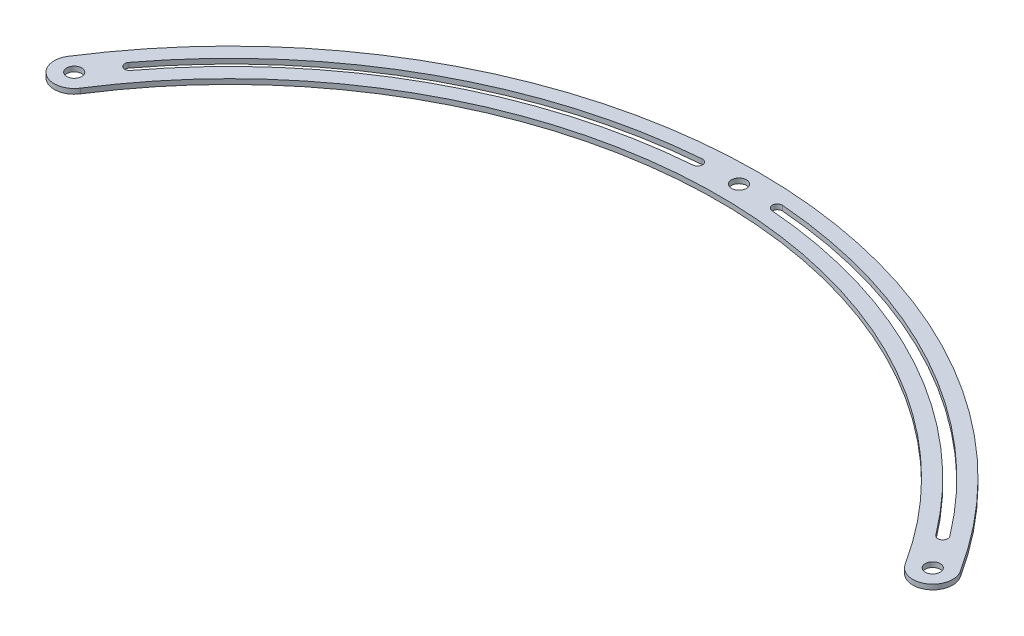
ISO-10303-21;
HEADER;
FILE_DESCRIPTION(('STEP AP214'),'2;1');
FILE_NAME('part.step','',(''),(''),'','','');
FILE_SCHEMA(('AUTOMOTIVE_DESIGN { 1 0 10303 214 1 1 1 1 }'));
ENDSEC;
DATA;
#1=APPLICATION_CONTEXT('core data for automotive mechanical design processes');
#2=APPLICATION_PROTOCOL_DEFINITION('international standard','automotive_design',2000,#1);
#3=PRODUCT_CONTEXT('',#1,'mechanical');
#4=PRODUCT('Part','Part','',(#3));
#5=PRODUCT_RELATED_PRODUCT_CATEGORY('part','',(#4));
#6=PRODUCT_DEFINITION_FORMATION('','',#4);
#7=PRODUCT_DEFINITION_CONTEXT('part definition',#1,'design');
#8=PRODUCT_DEFINITION('design','',#6,#7);
#9=PRODUCT_DEFINITION_SHAPE('','',#8);
#10=(LENGTH_UNIT() NAMED_UNIT(*) SI_UNIT(.MILLI.,.METRE.));
#11=(NAMED_UNIT(*) PLANE_ANGLE_UNIT() SI_UNIT($,.RADIAN.));
#12=(NAMED_UNIT(*) SI_UNIT($,.STERADIAN.) SOLID_ANGLE_UNIT());
#13=UNCERTAINTY_MEASURE_WITH_UNIT(LENGTH_MEASURE(1.E-05),#10,'distance_accuracy_value','');
#14=(GEOMETRIC_REPRESENTATION_CONTEXT(3) GLOBAL_UNCERTAINTY_ASSIGNED_CONTEXT((#13)) GLOBAL_UNIT_ASSIGNED_CONTEXT((#10,
#11,#12)) REPRESENTATION_CONTEXT('',''));
#15=CARTESIAN_POINT('',(0.,0.,0.));
#16=DIRECTION('',(0.,0.,1.));
#17=DIRECTION('',(1.,0.,0.));
#18=AXIS2_PLACEMENT_3D('',#15,#16,#17);
#19=CARTESIAN_POINT('',(43.0129637364572,1.,-27.4022800256879));
#20=DIRECTION('',(0.,1.,0.));
#21=DIRECTION('',(0.,0.,1.));
#22=AXIS2_PLACEMENT_3D('',#19,#20,#21);
#23=PLANE('',#22);
#24=CARTESIAN_POINT('',(-86.0259274729145,1.,-54.8045600513758));
#25=DIRECTION('',(0.,1.,0.));
#26=DIRECTION('',(0.,0.,1.));
#27=AXIS2_PLACEMENT_3D('',#24,#25,#26);
#28=CIRCLE('',#27,1.50000000000005);
#29=CARTESIAN_POINT('',(-86.0259274729145,1.,-53.3045600513758));
#30=VERTEX_POINT('',#29);
#31=EDGE_CURVE('E199',#30,#30,#28,.T.);
#32=ORIENTED_EDGE('',*,*,#31,.F.);
#33=EDGE_LOOP('',(#32));
#34=FACE_BOUND('',#33,.T.);
#35=CARTESIAN_POINT('',(86.0259274729145,1.,-54.8045600513759));
#36=DIRECTION('',(0.,1.,0.));
#37=DIRECTION('',(0.,0.,1.));
#38=AXIS2_PLACEMENT_3D('',#35,#36,#37);
#39=CIRCLE('',#38,4.00000000000002);
#40=CARTESIAN_POINT('',(82.6523616896629,1.,-52.6553616179886));
#41=VERTEX_POINT('',#40);
#42=CARTESIAN_POINT('',(89.399493256166,1.,-56.9537584847631));
#43=VERTEX_POINT('',#42);
#44=EDGE_CURVE('E211',#41,#43,#39,.T.);
#45=ORIENTED_EDGE('',*,*,#44,.T.);
#46=CARTESIAN_POINT('',(0.,1.,0.));
#47=DIRECTION('',(0.,1.,0.));
#48=DIRECTION('',(0.,0.,1.));
#49=AXIS2_PLACEMENT_3D('',#46,#47,#48);
#50=CIRCLE('',#49,106.);
#51=CARTESIAN_POINT('',(-89.3994932561661,1.,-56.9537584847631));
#52=VERTEX_POINT('',#51);
#53=EDGE_CURVE('E214',#43,#52,#50,.T.);
#54=ORIENTED_EDGE('',*,*,#53,.T.);
#55=CARTESIAN_POINT('',(-86.0259274729145,1.,-54.8045600513758));
#56=DIRECTION('',(0.,1.,0.));
#57=DIRECTION('',(0.,0.,1.));
#58=AXIS2_PLACEMENT_3D('',#55,#56,#57);
#59=CIRCLE('',#58,4.00000000000001);
#60=CARTESIAN_POINT('',(-82.652361689663,1.,-52.6553616179885));
#61=VERTEX_POINT('',#60);
#62=EDGE_CURVE('E217',#52,#61,#59,.T.);
#63=ORIENTED_EDGE('',*,*,#62,.T.);
#64=CARTESIAN_POINT('',(0.,1.,0.));
#65=DIRECTION('',(0.,-1.,0.));
#66=DIRECTION('',(0.,0.,1.));
#67=AXIS2_PLACEMENT_3D('',#64,#65,#66);
#68=CIRCLE('',#67,98.);
#69=EDGE_CURVE('E219',#61,#41,#68,.T.);
#70=ORIENTED_EDGE('',*,*,#69,.T.);
#71=EDGE_LOOP('',(#45,#54,#63,#70));
#72=FACE_BOUND('',#71,.T.);
#73=CARTESIAN_POINT('',(0.,1.,-102.));
#74=DIRECTION('',(0.,1.,0.));
#75=DIRECTION('',(0.,0.,1.));
#76=AXIS2_PLACEMENT_3D('',#73,#74,#75);
#77=CIRCLE('',#76,1.5);
#78=CARTESIAN_POINT('',(0.,1.,-100.5));
#79=VERTEX_POINT('',#78);
#80=EDGE_CURVE('E205',#79,#79,#77,.T.);
#81=ORIENTED_EDGE('',*,*,#80,.F.);
#82=EDGE_LOOP('',(#81));
#83=FACE_BOUND('',#82,.T.);
#84=CARTESIAN_POINT('',(86.0259274729145,1.,-54.8045600513759));
#85=DIRECTION('',(0.,1.,0.));
#86=DIRECTION('',(0.,0.,1.));
#87=AXIS2_PLACEMENT_3D('',#84,#85,#86);
#88=CIRCLE('',#87,1.5);
#89=CARTESIAN_POINT('',(86.0259274729145,1.,-53.3045600513759));
#90=VERTEX_POINT('',#89);
#91=EDGE_CURVE('E193',#90,#90,#88,.T.);
#92=ORIENTED_EDGE('',*,*,#91,.F.);
#93=EDGE_LOOP('',(#92));
#94=FACE_BOUND('',#93,.T.);
#95=CARTESIAN_POINT('',(0.,1.,0.));
#96=DIRECTION('',(0.,1.,0.));
#97=DIRECTION('',(0.,0.,1.));
#98=AXIS2_PLACEMENT_3D('',#95,#96,#97);
#99=CIRCLE('',#98,103.);
#100=CARTESIAN_POINT('',(-8.07843137254902,1.,-102.682710066296));
#101=VERTEX_POINT('',#100);
#102=CARTESIAN_POINT('',(-82.2649323344337,1.,-61.9796814126294));
#103=VERTEX_POINT('',#102);
#104=EDGE_CURVE('E164',#101,#103,#99,.T.);
#105=ORIENTED_EDGE('',*,*,#104,.F.);
#106=CARTESIAN_POINT('',(-8.,1.,-101.685790551089));
#107=DIRECTION('',(0.,1.,0.));
#108=DIRECTION('',(0.,0.,1.));
#109=AXIS2_PLACEMENT_3D('',#106,#107,#108);
#110=CIRCLE('',#109,1.);
#111=CARTESIAN_POINT('',(-7.92156862745098,1.,-100.688871035882));
#112=VERTEX_POINT('',#111);
#113=EDGE_CURVE('E162',#112,#101,#110,.T.);
#114=ORIENTED_EDGE('',*,*,#113,.F.);
#115=CARTESIAN_POINT('',(0.,1.,0.));
#116=DIRECTION('',(0.,-1.,0.));
#117=DIRECTION('',(0.,0.,1.));
#118=AXIS2_PLACEMENT_3D('',#115,#116,#117);
#119=CIRCLE('',#118,101.);
#120=CARTESIAN_POINT('',(-80.6675550075516,1.,-60.7761924531608));
#121=VERTEX_POINT('',#120);
#122=EDGE_CURVE('E170',#121,#112,#119,.T.);
#123=ORIENTED_EDGE('',*,*,#122,.F.);
#124=CARTESIAN_POINT('',(-81.4662436709927,1.,-61.3779369328951));
#125=DIRECTION('',(0.,1.,0.));
#126=DIRECTION('',(0.,0.,1.));
#127=AXIS2_PLACEMENT_3D('',#124,#125,#126);
#128=CIRCLE('',#127,0.999999999999993);
#129=EDGE_CURVE('E167',#103,#121,#128,.T.);
#130=ORIENTED_EDGE('',*,*,#129,.F.);
#131=EDGE_LOOP('',(#105,#114,#123,#130));
#132=FACE_BOUND('',#131,.T.);
#133=CARTESIAN_POINT('',(0.,1.,0.));
#134=DIRECTION('',(0.,1.,0.));
#135=DIRECTION('',(0.,0.,1.));
#136=AXIS2_PLACEMENT_3D('',#133,#134,#135);
#137=CIRCLE('',#136,103.);
#138=CARTESIAN_POINT('',(82.2649323344338,1.,-61.9796814126294));
#139=VERTEX_POINT('',#138);
#140=CARTESIAN_POINT('',(8.07843137254901,1.,-102.682710066296));
#141=VERTEX_POINT('',#140);
#142=EDGE_CURVE('E134',#139,#141,#137,.T.);
#143=ORIENTED_EDGE('',*,*,#142,.F.);
#144=CARTESIAN_POINT('',(81.4662436709927,1.,-61.3779369328951));
#145=DIRECTION('',(0.,1.,0.));
#146=DIRECTION('',(0.,0.,1.));
#147=AXIS2_PLACEMENT_3D('',#144,#145,#146);
#148=CIRCLE('',#147,0.999999999999986);
#149=CARTESIAN_POINT('',(80.6675550075516,1.,-60.7761924531609));
#150=VERTEX_POINT('',#149);
#151=EDGE_CURVE('E126',#150,#139,#148,.T.);
#152=ORIENTED_EDGE('',*,*,#151,.F.);
#153=CARTESIAN_POINT('',(0.,1.,0.));
#154=DIRECTION('',(0.,-1.,0.));
#155=DIRECTION('',(0.,0.,1.));
#156=AXIS2_PLACEMENT_3D('',#153,#154,#155);
#157=CIRCLE('',#156,101.);
#158=CARTESIAN_POINT('',(7.92156862745098,1.,-100.688871035883));
#159=VERTEX_POINT('',#158);
#160=EDGE_CURVE('E148',#159,#150,#157,.T.);
#161=ORIENTED_EDGE('',*,*,#160,.F.);
#162=CARTESIAN_POINT('',(8.,1.,-101.685790551089));
#163=DIRECTION('',(0.,1.,0.));
#164=DIRECTION('',(0.,0.,1.));
#165=AXIS2_PLACEMENT_3D('',#162,#163,#164);
#166=CIRCLE('',#165,0.999999999999994);
#167=EDGE_CURVE('E146',#141,#159,#166,.T.);
#168=ORIENTED_EDGE('',*,*,#167,.F.);
#169=EDGE_LOOP('',(#143,#152,#161,#168));
#170=FACE_BOUND('',#169,.T.);
#171=ADVANCED_FACE('F37',(#34,#72,#83,#94,#132,#170),#23,.T.);
#172=CARTESIAN_POINT('',(43.0129637364572,0.,-27.4022800256879));
#173=DIRECTION('',(0.,1.,0.));
#174=DIRECTION('',(0.,0.,1.));
#175=AXIS2_PLACEMENT_3D('',#172,#173,#174);
#176=PLANE('',#175);
#177=CARTESIAN_POINT('',(-8.,0.,-101.685790551089));
#178=DIRECTION('',(0.,1.,0.));
#179=DIRECTION('',(0.,0.,1.));
#180=AXIS2_PLACEMENT_3D('',#177,#178,#179);
#181=CIRCLE('',#180,1.);
#182=CARTESIAN_POINT('',(-7.92156862745098,0.,-100.688871035882));
#183=VERTEX_POINT('',#182);
#184=CARTESIAN_POINT('',(-8.07843137254902,0.,-102.682710066296));
#185=VERTEX_POINT('',#184);
#186=EDGE_CURVE('E142',#183,#185,#181,.T.);
#187=ORIENTED_EDGE('',*,*,#186,.T.);
#188=CARTESIAN_POINT('',(0.,0.,0.));
#189=DIRECTION('',(0.,1.,0.));
#190=DIRECTION('',(0.,0.,1.));
#191=AXIS2_PLACEMENT_3D('',#188,#189,#190);
#192=CIRCLE('',#191,103.);
#193=CARTESIAN_POINT('',(-82.2649323344337,0.,-61.9796814126294));
#194=VERTEX_POINT('',#193);
#195=EDGE_CURVE('E175',#185,#194,#192,.T.);
#196=ORIENTED_EDGE('',*,*,#195,.T.);
#197=CARTESIAN_POINT('',(-81.4662436709927,0.,-61.3779369328951));
#198=DIRECTION('',(0.,1.,0.));
#199=DIRECTION('',(0.,0.,1.));
#200=AXIS2_PLACEMENT_3D('',#197,#198,#199);
#201=CIRCLE('',#200,0.999999999999993);
#202=CARTESIAN_POINT('',(-80.6675550075516,0.,-60.7761924531608));
#203=VERTEX_POINT('',#202);
#204=EDGE_CURVE('E178',#194,#203,#201,.T.);
#205=ORIENTED_EDGE('',*,*,#204,.T.);
#206=CARTESIAN_POINT('',(0.,0.,0.));
#207=DIRECTION('',(0.,-1.,0.));
#208=DIRECTION('',(0.,0.,1.));
#209=AXIS2_PLACEMENT_3D('',#206,#207,#208);
#210=CIRCLE('',#209,101.);
#211=EDGE_CURVE('E165',#203,#183,#210,.T.);
#212=ORIENTED_EDGE('',*,*,#211,.T.);
#213=EDGE_LOOP('',(#187,#196,#205,#212));
#214=FACE_BOUND('',#213,.T.);
#215=CARTESIAN_POINT('',(86.0259274729145,0.,-54.8045600513759));
#216=DIRECTION('',(0.,1.,0.));
#217=DIRECTION('',(0.,0.,1.));
#218=AXIS2_PLACEMENT_3D('',#215,#216,#217);
#219=CIRCLE('',#218,4.00000000000002);
#220=CARTESIAN_POINT('',(82.6523616896629,0.,-52.6553616179886));
#221=VERTEX_POINT('',#220);
#222=CARTESIAN_POINT('',(89.399493256166,0.,-56.9537584847631));
#223=VERTEX_POINT('',#222);
#224=EDGE_CURVE('E208',#221,#223,#219,.T.);
#225=ORIENTED_EDGE('',*,*,#224,.F.);
#226=CARTESIAN_POINT('',(0.,0.,0.));
#227=DIRECTION('',(0.,-1.,0.));
#228=DIRECTION('',(0.,0.,1.));
#229=AXIS2_PLACEMENT_3D('',#226,#227,#228);
#230=CIRCLE('',#229,98.);
#231=CARTESIAN_POINT('',(-82.652361689663,0.,-52.6553616179885));
#232=VERTEX_POINT('',#231);
#233=EDGE_CURVE('E215',#232,#221,#230,.T.);
#234=ORIENTED_EDGE('',*,*,#233,.F.);
#235=CARTESIAN_POINT('',(-86.0259274729145,0.,-54.8045600513758));
#236=DIRECTION('',(0.,1.,0.));
#237=DIRECTION('',(0.,0.,1.));
#238=AXIS2_PLACEMENT_3D('',#235,#236,#237);
#239=CIRCLE('',#238,4.00000000000001);
#240=CARTESIAN_POINT('',(-89.3994932561661,0.,-56.9537584847631));
#241=VERTEX_POINT('',#240);
#242=EDGE_CURVE('E226',#241,#232,#239,.T.);
#243=ORIENTED_EDGE('',*,*,#242,.F.);
#244=CARTESIAN_POINT('',(0.,0.,0.));
#245=DIRECTION('',(0.,1.,0.));
#246=DIRECTION('',(0.,0.,1.));
#247=AXIS2_PLACEMENT_3D('',#244,#245,#246);
#248=CIRCLE('',#247,106.);
#249=EDGE_CURVE('E224',#223,#241,#248,.T.);
#250=ORIENTED_EDGE('',*,*,#249,.F.);
#251=EDGE_LOOP('',(#225,#234,#243,#250));
#252=FACE_BOUND('',#251,.T.);
#253=CARTESIAN_POINT('',(0.,0.,-102.));
#254=DIRECTION('',(0.,1.,0.));
#255=DIRECTION('',(0.,0.,1.));
#256=AXIS2_PLACEMENT_3D('',#253,#254,#255);
#257=CIRCLE('',#256,1.5);
#258=CARTESIAN_POINT('',(0.,0.,-100.5));
#259=VERTEX_POINT('',#258);
#260=EDGE_CURVE('E202',#259,#259,#257,.T.);
#261=ORIENTED_EDGE('',*,*,#260,.T.);
#262=EDGE_LOOP('',(#261));
#263=FACE_BOUND('',#262,.T.);
#264=CARTESIAN_POINT('',(-86.0259274729145,0.,-54.8045600513758));
#265=DIRECTION('',(0.,1.,0.));
#266=DIRECTION('',(0.,0.,1.));
#267=AXIS2_PLACEMENT_3D('',#264,#265,#266);
#268=CIRCLE('',#267,1.50000000000005);
#269=CARTESIAN_POINT('',(-86.0259274729145,0.,-53.3045600513758));
#270=VERTEX_POINT('',#269);
#271=EDGE_CURVE('E196',#270,#270,#268,.T.);
#272=ORIENTED_EDGE('',*,*,#271,.T.);
#273=EDGE_LOOP('',(#272));
#274=FACE_BOUND('',#273,.T.);
#275=CARTESIAN_POINT('',(86.0259274729145,0.,-54.8045600513759));
#276=DIRECTION('',(0.,1.,0.));
#277=DIRECTION('',(0.,0.,1.));
#278=AXIS2_PLACEMENT_3D('',#275,#276,#277);
#279=CIRCLE('',#278,1.5);
#280=CARTESIAN_POINT('',(86.0259274729145,0.,-53.3045600513759));
#281=VERTEX_POINT('',#280);
#282=EDGE_CURVE('E192',#281,#281,#279,.T.);
#283=ORIENTED_EDGE('',*,*,#282,.T.);
#284=EDGE_LOOP('',(#283));
#285=FACE_BOUND('',#284,.T.);
#286=CARTESIAN_POINT('',(81.4662436709927,0.,-61.3779369328951));
#287=DIRECTION('',(0.,1.,0.));
#288=DIRECTION('',(0.,0.,1.));
#289=AXIS2_PLACEMENT_3D('',#286,#287,#288);
#290=CIRCLE('',#289,0.999999999999986);
#291=CARTESIAN_POINT('',(80.6675550075516,0.,-60.7761924531609));
#292=VERTEX_POINT('',#291);
#293=CARTESIAN_POINT('',(82.2649323344338,0.,-61.9796814126294));
#294=VERTEX_POINT('',#293);
#295=EDGE_CURVE('E60',#292,#294,#290,.T.);
#296=ORIENTED_EDGE('',*,*,#295,.T.);
#297=CARTESIAN_POINT('',(0.,0.,0.));
#298=DIRECTION('',(0.,1.,0.));
#299=DIRECTION('',(0.,0.,1.));
#300=AXIS2_PLACEMENT_3D('',#297,#298,#299);
#301=CIRCLE('',#300,103.);
#302=CARTESIAN_POINT('',(8.07843137254901,0.,-102.682710066296));
#303=VERTEX_POINT('',#302);
#304=EDGE_CURVE('E141',#294,#303,#301,.T.);
#305=ORIENTED_EDGE('',*,*,#304,.T.);
#306=CARTESIAN_POINT('',(8.,0.,-101.685790551089));
#307=DIRECTION('',(0.,1.,0.));
#308=DIRECTION('',(0.,0.,1.));
#309=AXIS2_PLACEMENT_3D('',#306,#307,#308);
#310=CIRCLE('',#309,0.999999999999994);
#311=CARTESIAN_POINT('',(7.92156862745098,0.,-100.688871035883));
#312=VERTEX_POINT('',#311);
#313=EDGE_CURVE('E154',#303,#312,#310,.T.);
#314=ORIENTED_EDGE('',*,*,#313,.T.);
#315=CARTESIAN_POINT('',(0.,0.,0.));
#316=DIRECTION('',(0.,-1.,0.));
#317=DIRECTION('',(0.,0.,1.));
#318=AXIS2_PLACEMENT_3D('',#315,#316,#317);
#319=CIRCLE('',#318,101.);
#320=EDGE_CURVE('E135',#312,#292,#319,.T.);
#321=ORIENTED_EDGE('',*,*,#320,.T.);
#322=EDGE_LOOP('',(#296,#305,#314,#321));
#323=FACE_BOUND('',#322,.T.);
#324=ADVANCED_FACE('F244',(#214,#252,#263,#274,#285,#323),#176,.F.);
#325=CARTESIAN_POINT('',(86.0259274729145,1.,-54.8045600513759));
#326=DIRECTION('',(0.,-1.,0.));
#327=DIRECTION('',(0.,0.,-1.));
#328=AXIS2_PLACEMENT_3D('',#325,#326,#327);
#329=CYLINDRICAL_SURFACE('',#328,4.00000000000002);
#330=ORIENTED_EDGE('',*,*,#224,.T.);
#331=DIRECTION('',(0.,-1.,0.));
#332=VECTOR('',#331,1.);
#333=CARTESIAN_POINT('',(89.399493256166,1.,-56.9537584847631));
#334=LINE('',#333,#332);
#335=EDGE_CURVE('E11',#43,#223,#334,.T.);
#336=ORIENTED_EDGE('',*,*,#335,.F.);
#337=ORIENTED_EDGE('',*,*,#44,.F.);
#338=DIRECTION('',(0.,-1.,0.));
#339=VECTOR('',#338,1.);
#340=CARTESIAN_POINT('',(82.6523616896629,1.,-52.6553616179886));
#341=LINE('',#340,#339);
#342=EDGE_CURVE('E221',#41,#221,#341,.T.);
#343=ORIENTED_EDGE('',*,*,#342,.T.);
#344=EDGE_LOOP('',(#330,#336,#337,#343));
#345=FACE_BOUND('',#344,.T.);
#346=ADVANCED_FACE('F39',(#345),#329,.T.);
#347=CARTESIAN_POINT('',(0.,1.,0.));
#348=DIRECTION('',(0.,-1.,0.));
#349=DIRECTION('',(0.,0.,-1.));
#350=AXIS2_PLACEMENT_3D('',#347,#348,#349);
#351=CYLINDRICAL_SURFACE('',#350,106.);
#352=ORIENTED_EDGE('',*,*,#249,.T.);
#353=DIRECTION('',(0.,-1.,0.));
#354=VECTOR('',#353,1.);
#355=CARTESIAN_POINT('',(-89.3994932561661,1.,-56.9537584847631));
#356=LINE('',#355,#354);
#357=EDGE_CURVE('E45',#52,#241,#356,.T.);
#358=ORIENTED_EDGE('',*,*,#357,.F.);
#359=ORIENTED_EDGE('',*,*,#53,.F.);
#360=ORIENTED_EDGE('',*,*,#335,.T.);
#361=EDGE_LOOP('',(#352,#358,#359,#360));
#362=FACE_BOUND('',#361,.T.);
#363=ADVANCED_FACE('F255',(#362),#351,.T.);
#364=CARTESIAN_POINT('',(-86.0259274729145,1.,-54.8045600513758));
#365=DIRECTION('',(0.,-1.,0.));
#366=DIRECTION('',(0.,0.,-1.));
#367=AXIS2_PLACEMENT_3D('',#364,#365,#366);
#368=CYLINDRICAL_SURFACE('',#367,4.00000000000001);
#369=ORIENTED_EDGE('',*,*,#242,.T.);
#370=DIRECTION('',(0.,-1.,0.));
#371=VECTOR('',#370,1.);
#372=CARTESIAN_POINT('',(-82.652361689663,1.,-52.6553616179885));
#373=LINE('',#372,#371);
#374=EDGE_CURVE('E231',#61,#232,#373,.T.);
#375=ORIENTED_EDGE('',*,*,#374,.F.);
#376=ORIENTED_EDGE('',*,*,#62,.F.);
#377=ORIENTED_EDGE('',*,*,#357,.T.);
#378=EDGE_LOOP('',(#369,#375,#376,#377));
#379=FACE_BOUND('',#378,.T.);
#380=ADVANCED_FACE('F238',(#379),#368,.T.);
#381=CARTESIAN_POINT('',(0.,1.,0.));
#382=DIRECTION('',(0.,-1.,0.));
#383=DIRECTION('',(0.,0.,-1.));
#384=AXIS2_PLACEMENT_3D('',#381,#382,#383);
#385=CYLINDRICAL_SURFACE('',#384,98.);
#386=ORIENTED_EDGE('',*,*,#233,.T.);
#387=ORIENTED_EDGE('',*,*,#342,.F.);
#388=ORIENTED_EDGE('',*,*,#69,.F.);
#389=ORIENTED_EDGE('',*,*,#374,.T.);
#390=EDGE_LOOP('',(#386,#387,#388,#389));
#391=FACE_BOUND('',#390,.T.);
#392=ADVANCED_FACE('F248',(#391),#385,.F.);
#393=CARTESIAN_POINT('',(0.,1.,-102.));
#394=DIRECTION('',(0.,-1.,0.));
#395=DIRECTION('',(0.,0.,-1.));
#396=AXIS2_PLACEMENT_3D('',#393,#394,#395);
#397=CYLINDRICAL_SURFACE('',#396,1.5);
#398=ORIENTED_EDGE('',*,*,#80,.T.);
#399=EDGE_LOOP('',(#398));
#400=FACE_BOUND('',#399,.T.);
#401=ORIENTED_EDGE('',*,*,#260,.F.);
#402=EDGE_LOOP('',(#401));
#403=FACE_BOUND('',#402,.T.);
#404=ADVANCED_FACE('F272',(#400,#403),#397,.F.);
#405=CARTESIAN_POINT('',(-86.0259274729145,1.,-54.8045600513758));
#406=DIRECTION('',(0.,-1.,0.));
#407=DIRECTION('',(0.,0.,-1.));
#408=AXIS2_PLACEMENT_3D('',#405,#406,#407);
#409=CYLINDRICAL_SURFACE('',#408,1.50000000000005);
#410=ORIENTED_EDGE('',*,*,#31,.T.);
#411=EDGE_LOOP('',(#410));
#412=FACE_BOUND('',#411,.T.);
#413=ORIENTED_EDGE('',*,*,#271,.F.);
#414=EDGE_LOOP('',(#413));
#415=FACE_BOUND('',#414,.T.);
#416=ADVANCED_FACE('F279',(#412,#415),#409,.F.);
#417=CARTESIAN_POINT('',(86.0259274729145,1.,-54.8045600513759));
#418=DIRECTION('',(0.,-1.,0.));
#419=DIRECTION('',(0.,0.,-1.));
#420=AXIS2_PLACEMENT_3D('',#417,#418,#419);
#421=CYLINDRICAL_SURFACE('',#420,1.5);
#422=ORIENTED_EDGE('',*,*,#91,.T.);
#423=EDGE_LOOP('',(#422));
#424=FACE_BOUND('',#423,.T.);
#425=ORIENTED_EDGE('',*,*,#282,.F.);
#426=EDGE_LOOP('',(#425));
#427=FACE_BOUND('',#426,.T.);
#428=ADVANCED_FACE('F284',(#424,#427),#421,.F.);
#429=CARTESIAN_POINT('',(-8.,1.,-101.685790551089));
#430=DIRECTION('',(0.,-1.,0.));
#431=DIRECTION('',(0.,0.,-1.));
#432=AXIS2_PLACEMENT_3D('',#429,#430,#431);
#433=CYLINDRICAL_SURFACE('',#432,1.);
#434=ORIENTED_EDGE('',*,*,#186,.F.);
#435=DIRECTION('',(0.,-1.,0.));
#436=VECTOR('',#435,1.);
#437=CARTESIAN_POINT('',(-7.92156862745098,1.,-100.688871035882));
#438=LINE('',#437,#436);
#439=EDGE_CURVE('E172',#112,#183,#438,.T.);
#440=ORIENTED_EDGE('',*,*,#439,.F.);
#441=ORIENTED_EDGE('',*,*,#113,.T.);
#442=DIRECTION('',(0.,-1.,0.));
#443=VECTOR('',#442,1.);
#444=CARTESIAN_POINT('',(-8.07843137254902,1.,-102.682710066296));
#445=LINE('',#444,#443);
#446=EDGE_CURVE('E189',#101,#185,#445,.T.);
#447=ORIENTED_EDGE('',*,*,#446,.T.);
#448=EDGE_LOOP('',(#434,#440,#441,#447));
#449=FACE_BOUND('',#448,.T.);
#450=ADVANCED_FACE('F320',(#449),#433,.F.);
#451=CARTESIAN_POINT('',(0.,1.,0.));
#452=DIRECTION('',(0.,-1.,0.));
#453=DIRECTION('',(0.,0.,-1.));
#454=AXIS2_PLACEMENT_3D('',#451,#452,#453);
#455=CYLINDRICAL_SURFACE('',#454,103.);
#456=ORIENTED_EDGE('',*,*,#195,.F.);
#457=ORIENTED_EDGE('',*,*,#446,.F.);
#458=ORIENTED_EDGE('',*,*,#104,.T.);
#459=DIRECTION('',(0.,-1.,0.));
#460=VECTOR('',#459,1.);
#461=CARTESIAN_POINT('',(-82.2649323344337,1.,-61.9796814126294));
#462=LINE('',#461,#460);
#463=EDGE_CURVE('E187',#103,#194,#462,.T.);
#464=ORIENTED_EDGE('',*,*,#463,.T.);
#465=EDGE_LOOP('',(#456,#457,#458,#464));
#466=FACE_BOUND('',#465,.T.);
#467=ADVANCED_FACE('F316',(#466),#455,.F.);
#468=CARTESIAN_POINT('',(-81.4662436709927,1.,-61.3779369328951));
#469=DIRECTION('',(0.,-1.,0.));
#470=DIRECTION('',(0.,0.,-1.));
#471=AXIS2_PLACEMENT_3D('',#468,#469,#470);
#472=CYLINDRICAL_SURFACE('',#471,0.999999999999993);
#473=ORIENTED_EDGE('',*,*,#204,.F.);
#474=ORIENTED_EDGE('',*,*,#463,.F.);
#475=ORIENTED_EDGE('',*,*,#129,.T.);
#476=DIRECTION('',(0.,-1.,0.));
#477=VECTOR('',#476,1.);
#478=CARTESIAN_POINT('',(-80.6675550075516,1.,-60.7761924531608));
#479=LINE('',#478,#477);
#480=EDGE_CURVE('E185',#121,#203,#479,.T.);
#481=ORIENTED_EDGE('',*,*,#480,.T.);
#482=EDGE_LOOP('',(#473,#474,#475,#481));
#483=FACE_BOUND('',#482,.T.);
#484=ADVANCED_FACE('F312',(#483),#472,.F.);
#485=CARTESIAN_POINT('',(0.,1.,0.));
#486=DIRECTION('',(0.,-1.,0.));
#487=DIRECTION('',(0.,0.,-1.));
#488=AXIS2_PLACEMENT_3D('',#485,#486,#487);
#489=CYLINDRICAL_SURFACE('',#488,101.);
#490=ORIENTED_EDGE('',*,*,#211,.F.);
#491=ORIENTED_EDGE('',*,*,#480,.F.);
#492=ORIENTED_EDGE('',*,*,#122,.T.);
#493=ORIENTED_EDGE('',*,*,#439,.T.);
#494=EDGE_LOOP('',(#490,#491,#492,#493));
#495=FACE_BOUND('',#494,.T.);
#496=ADVANCED_FACE('F309',(#495),#489,.T.);
#497=CARTESIAN_POINT('',(81.4662436709927,1.,-61.3779369328951));
#498=DIRECTION('',(0.,-1.,0.));
#499=DIRECTION('',(0.,0.,-1.));
#500=AXIS2_PLACEMENT_3D('',#497,#498,#499);
#501=CYLINDRICAL_SURFACE('',#500,0.999999999999986);
#502=ORIENTED_EDGE('',*,*,#295,.F.);
#503=DIRECTION('',(0.,-1.,0.));
#504=VECTOR('',#503,1.);
#505=CARTESIAN_POINT('',(80.6675550075516,1.,-60.7761924531609));
#506=LINE('',#505,#504);
#507=EDGE_CURVE('E130',#150,#292,#506,.T.);
#508=ORIENTED_EDGE('',*,*,#507,.F.);
#509=ORIENTED_EDGE('',*,*,#151,.T.);
#510=DIRECTION('',(0.,-1.,0.));
#511=VECTOR('',#510,1.);
#512=CARTESIAN_POINT('',(82.2649323344338,1.,-61.9796814126294));
#513=LINE('',#512,#511);
#514=EDGE_CURVE('E129',#139,#294,#513,.T.);
#515=ORIENTED_EDGE('',*,*,#514,.T.);
#516=EDGE_LOOP('',(#502,#508,#509,#515));
#517=FACE_BOUND('',#516,.T.);
#518=ADVANCED_FACE('F128',(#517),#501,.F.);
#519=CARTESIAN_POINT('',(0.,1.,0.));
#520=DIRECTION('',(0.,-1.,0.));
#521=DIRECTION('',(0.,0.,-1.));
#522=AXIS2_PLACEMENT_3D('',#519,#520,#521);
#523=CYLINDRICAL_SURFACE('',#522,103.);
#524=ORIENTED_EDGE('',*,*,#304,.F.);
#525=ORIENTED_EDGE('',*,*,#514,.F.);
#526=ORIENTED_EDGE('',*,*,#142,.T.);
#527=DIRECTION('',(0.,-1.,0.));
#528=VECTOR('',#527,1.);
#529=CARTESIAN_POINT('',(8.07843137254901,1.,-102.682710066296));
#530=LINE('',#529,#528);
#531=EDGE_CURVE('E143',#141,#303,#530,.T.);
#532=ORIENTED_EDGE('',*,*,#531,.T.);
#533=EDGE_LOOP('',(#524,#525,#526,#532));
#534=FACE_BOUND('',#533,.T.);
#535=ADVANCED_FACE('F138',(#534),#523,.F.);
#536=CARTESIAN_POINT('',(8.,1.,-101.685790551089));
#537=DIRECTION('',(0.,-1.,0.));
#538=DIRECTION('',(0.,0.,-1.));
#539=AXIS2_PLACEMENT_3D('',#536,#537,#538);
#540=CYLINDRICAL_SURFACE('',#539,0.999999999999994);
#541=ORIENTED_EDGE('',*,*,#313,.F.);
#542=ORIENTED_EDGE('',*,*,#531,.F.);
#543=ORIENTED_EDGE('',*,*,#167,.T.);
#544=DIRECTION('',(0.,-1.,0.));
#545=VECTOR('',#544,1.);
#546=CARTESIAN_POINT('',(7.92156862745098,1.,-100.688871035883));
#547=LINE('',#546,#545);
#548=EDGE_CURVE('E52',#159,#312,#547,.T.);
#549=ORIENTED_EDGE('',*,*,#548,.T.);
#550=EDGE_LOOP('',(#541,#542,#543,#549));
#551=FACE_BOUND('',#550,.T.);
#552=ADVANCED_FACE('F297',(#551),#540,.F.);
#553=CARTESIAN_POINT('',(0.,1.,0.));
#554=DIRECTION('',(0.,-1.,0.));
#555=DIRECTION('',(0.,0.,-1.));
#556=AXIS2_PLACEMENT_3D('',#553,#554,#555);
#557=CYLINDRICAL_SURFACE('',#556,101.);
#558=ORIENTED_EDGE('',*,*,#320,.F.);
#559=ORIENTED_EDGE('',*,*,#548,.F.);
#560=ORIENTED_EDGE('',*,*,#160,.T.);
#561=ORIENTED_EDGE('',*,*,#507,.T.);
#562=EDGE_LOOP('',(#558,#559,#560,#561));
#563=FACE_BOUND('',#562,.T.);
#564=ADVANCED_FACE('F295',(#563),#557,.T.);
#565=CLOSED_SHELL('',(#171,#324,#346,#363,#380,#392,#404,#416,#428,#450,#467,#484,#496,#518,
#535,#552,#564));
#566=MANIFOLD_SOLID_BREP('B2',#565);
#567=ADVANCED_BREP_SHAPE_REPRESENTATION('',(#18,#566),#14);
#568=SHAPE_DEFINITION_REPRESENTATION(#9,#567);
ENDSEC;
END-ISO-10303-21;
